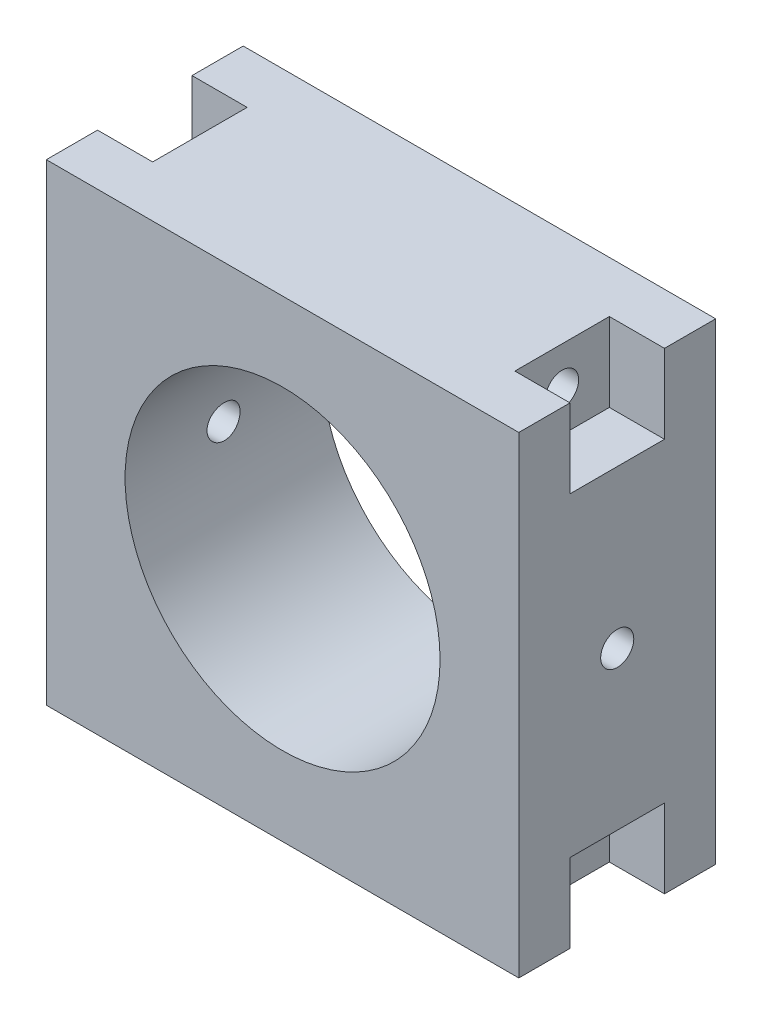
ISO-10303-21;
HEADER;
FILE_DESCRIPTION(('STEP AP214'),'2;1');
FILE_NAME('part.step','',(''),(''),'','','');
FILE_SCHEMA(('AUTOMOTIVE_DESIGN { 1 0 10303 214 1 1 1 1 }'));
ENDSEC;
DATA;
#1=APPLICATION_CONTEXT('core data for automotive mechanical design processes');
#2=APPLICATION_PROTOCOL_DEFINITION('international standard','automotive_design',2000,#1);
#3=PRODUCT_CONTEXT('',#1,'mechanical');
#4=PRODUCT('Part','Part','',(#3));
#5=PRODUCT_RELATED_PRODUCT_CATEGORY('part','',(#4));
#6=PRODUCT_DEFINITION_FORMATION('','',#4);
#7=PRODUCT_DEFINITION_CONTEXT('part definition',#1,'design');
#8=PRODUCT_DEFINITION('design','',#6,#7);
#9=PRODUCT_DEFINITION_SHAPE('','',#8);
#10=(LENGTH_UNIT() NAMED_UNIT(*) SI_UNIT(.MILLI.,.METRE.));
#11=(NAMED_UNIT(*) PLANE_ANGLE_UNIT() SI_UNIT($,.RADIAN.));
#12=(NAMED_UNIT(*) SI_UNIT($,.STERADIAN.) SOLID_ANGLE_UNIT());
#13=UNCERTAINTY_MEASURE_WITH_UNIT(LENGTH_MEASURE(1.E-05),#10,'distance_accuracy_value','');
#14=(GEOMETRIC_REPRESENTATION_CONTEXT(3) GLOBAL_UNCERTAINTY_ASSIGNED_CONTEXT((#13)) GLOBAL_UNIT_ASSIGNED_CONTEXT((#10,
#11,#12)) REPRESENTATION_CONTEXT('',''));
#15=CARTESIAN_POINT('',(0.,0.,0.));
#16=DIRECTION('',(0.,0.,1.));
#17=DIRECTION('',(1.,0.,0.));
#18=AXIS2_PLACEMENT_3D('',#15,#16,#17);
#19=CARTESIAN_POINT('',(-30.,0.,25.));
#20=DIRECTION('',(-1.,0.,0.));
#21=DIRECTION('',(0.,0.,1.));
#22=AXIS2_PLACEMENT_3D('',#19,#20,#21);
#23=PLANE('',#22);
#24=CARTESIAN_POINT('',(-30.,0.,12.5));
#25=DIRECTION('',(1.,0.,0.));
#26=DIRECTION('',(0.,0.,-1.));
#27=AXIS2_PLACEMENT_3D('',#24,#25,#26);
#28=CIRCLE('',#27,2.1);
#29=CARTESIAN_POINT('',(-30.,0.,10.4));
#30=VERTEX_POINT('',#29);
#31=EDGE_CURVE('E353',#30,#30,#28,.T.);
#32=ORIENTED_EDGE('',*,*,#31,.T.);
#33=EDGE_LOOP('',(#32));
#34=FACE_BOUND('',#33,.T.);
#35=DIRECTION('',(0.,0.,-1.));
#36=VECTOR('',#35,1.);
#37=CARTESIAN_POINT('',(-30.,-30.,25.));
#38=LINE('',#37,#36);
#39=CARTESIAN_POINT('',(-30.,-30.,6.5));
#40=VERTEX_POINT('',#39);
#41=CARTESIAN_POINT('',(-30.,-30.,0.));
#42=VERTEX_POINT('',#41);
#43=EDGE_CURVE('E378',#40,#42,#38,.T.);
#44=ORIENTED_EDGE('',*,*,#43,.F.);
#45=DIRECTION('',(0.,-1.,0.));
#46=VECTOR('',#45,1.);
#47=CARTESIAN_POINT('',(-30.,-20.,6.5));
#48=LINE('',#47,#46);
#49=CARTESIAN_POINT('',(-30.,-20.,6.5));
#50=VERTEX_POINT('',#49);
#51=EDGE_CURVE('E229',#50,#40,#48,.T.);
#52=ORIENTED_EDGE('',*,*,#51,.F.);
#53=DIRECTION('',(0.,0.,1.));
#54=VECTOR('',#53,1.);
#55=CARTESIAN_POINT('',(-30.,-20.,0.));
#56=LINE('',#55,#54);
#57=CARTESIAN_POINT('',(-30.,-20.,18.5));
#58=VERTEX_POINT('',#57);
#59=EDGE_CURVE('E209',#50,#58,#56,.T.);
#60=ORIENTED_EDGE('',*,*,#59,.T.);
#61=DIRECTION('',(0.,-1.,0.));
#62=VECTOR('',#61,1.);
#63=CARTESIAN_POINT('',(-30.,-20.,18.5));
#64=LINE('',#63,#62);
#65=CARTESIAN_POINT('',(-30.,-30.,18.5));
#66=VERTEX_POINT('',#65);
#67=EDGE_CURVE('E194',#58,#66,#64,.T.);
#68=ORIENTED_EDGE('',*,*,#67,.T.);
#69=CARTESIAN_POINT('',(-30.,-30.,25.));
#70=VERTEX_POINT('',#69);
#71=EDGE_CURVE('E399',#70,#66,#38,.T.);
#72=ORIENTED_EDGE('',*,*,#71,.F.);
#73=DIRECTION('',(0.,1.,0.));
#74=VECTOR('',#73,1.);
#75=CARTESIAN_POINT('',(-30.,0.,25.));
#76=LINE('',#75,#74);
#77=CARTESIAN_POINT('',(-30.,30.,25.));
#78=VERTEX_POINT('',#77);
#79=EDGE_CURVE('E370',#70,#78,#76,.T.);
#80=ORIENTED_EDGE('',*,*,#79,.T.);
#81=DIRECTION('',(0.,0.,-1.));
#82=VECTOR('',#81,1.);
#83=CARTESIAN_POINT('',(-30.,30.,25.));
#84=LINE('',#83,#82);
#85=CARTESIAN_POINT('',(-30.,30.,18.5));
#86=VERTEX_POINT('',#85);
#87=EDGE_CURVE('E404',#78,#86,#84,.T.);
#88=ORIENTED_EDGE('',*,*,#87,.T.);
#89=DIRECTION('',(0.,1.,0.));
#90=VECTOR('',#89,1.);
#91=CARTESIAN_POINT('',(-30.,20.,18.5));
#92=LINE('',#91,#90);
#93=CARTESIAN_POINT('',(-30.,20.,18.5));
#94=VERTEX_POINT('',#93);
#95=EDGE_CURVE('E301',#94,#86,#92,.T.);
#96=ORIENTED_EDGE('',*,*,#95,.F.);
#97=DIRECTION('',(0.,0.,1.));
#98=VECTOR('',#97,1.);
#99=CARTESIAN_POINT('',(-30.,20.,0.));
#100=LINE('',#99,#98);
#101=CARTESIAN_POINT('',(-30.,20.,6.5));
#102=VERTEX_POINT('',#101);
#103=EDGE_CURVE('E278',#102,#94,#100,.T.);
#104=ORIENTED_EDGE('',*,*,#103,.F.);
#105=DIRECTION('',(0.,1.,0.));
#106=VECTOR('',#105,1.);
#107=CARTESIAN_POINT('',(-30.,20.,6.5));
#108=LINE('',#107,#106);
#109=CARTESIAN_POINT('',(-30.,30.,6.5));
#110=VERTEX_POINT('',#109);
#111=EDGE_CURVE('E304',#102,#110,#108,.T.);
#112=ORIENTED_EDGE('',*,*,#111,.T.);
#113=CARTESIAN_POINT('',(-30.,30.,0.));
#114=VERTEX_POINT('',#113);
#115=EDGE_CURVE('E403',#110,#114,#84,.T.);
#116=ORIENTED_EDGE('',*,*,#115,.T.);
#117=DIRECTION('',(0.,1.,0.));
#118=VECTOR('',#117,1.);
#119=CARTESIAN_POINT('',(-30.,0.,0.));
#120=LINE('',#119,#118);
#121=EDGE_CURVE('E392',#42,#114,#120,.T.);
#122=ORIENTED_EDGE('',*,*,#121,.F.);
#123=EDGE_LOOP('',(#44,#52,#60,#68,#72,#80,#88,#96,#104,#112,#116,#122));
#124=FACE_BOUND('',#123,.T.);
#125=ADVANCED_FACE('F44',(#34,#124),#23,.T.);
#126=CARTESIAN_POINT('',(0.,-30.,25.));
#127=DIRECTION('',(0.,1.,0.));
#128=DIRECTION('',(0.,0.,1.));
#129=AXIS2_PLACEMENT_3D('',#126,#127,#128);
#130=PLANE('',#129);
#131=DIRECTION('',(-1.,0.,0.));
#132=VECTOR('',#131,1.);
#133=CARTESIAN_POINT('',(0.,-30.,6.49999999999996));
#134=LINE('',#133,#132);
#135=CARTESIAN_POINT('',(-23.,-30.,6.5));
#136=VERTEX_POINT('',#135);
#137=EDGE_CURVE('E204',#136,#40,#134,.T.);
#138=ORIENTED_EDGE('',*,*,#137,.T.);
#139=ORIENTED_EDGE('',*,*,#43,.T.);
#140=DIRECTION('',(1.,0.,0.));
#141=VECTOR('',#140,1.);
#142=CARTESIAN_POINT('',(0.,-30.,0.));
#143=LINE('',#142,#141);
#144=CARTESIAN_POINT('',(30.,-30.,0.));
#145=VERTEX_POINT('',#144);
#146=EDGE_CURVE('E379',#42,#145,#143,.T.);
#147=ORIENTED_EDGE('',*,*,#146,.T.);
#148=DIRECTION('',(0.,0.,-1.));
#149=VECTOR('',#148,1.);
#150=CARTESIAN_POINT('',(30.,-30.,25.));
#151=LINE('',#150,#149);
#152=CARTESIAN_POINT('',(30.,-30.,6.50000000000001));
#153=VERTEX_POINT('',#152);
#154=EDGE_CURVE('E54',#153,#145,#151,.T.);
#155=ORIENTED_EDGE('',*,*,#154,.F.);
#156=DIRECTION('',(1.,0.,0.));
#157=VECTOR('',#156,1.);
#158=CARTESIAN_POINT('',(0.,-30.,6.49999999999996));
#159=LINE('',#158,#157);
#160=CARTESIAN_POINT('',(23.,-30.,6.5));
#161=VERTEX_POINT('',#160);
#162=EDGE_CURVE('E251',#161,#153,#159,.T.);
#163=ORIENTED_EDGE('',*,*,#162,.F.);
#164=DIRECTION('',(0.,0.,-1.));
#165=VECTOR('',#164,1.);
#166=CARTESIAN_POINT('',(23.,-30.,0.));
#167=LINE('',#166,#165);
#168=CARTESIAN_POINT('',(23.,-30.,18.5));
#169=VERTEX_POINT('',#168);
#170=EDGE_CURVE('E239',#169,#161,#167,.T.);
#171=ORIENTED_EDGE('',*,*,#170,.F.);
#172=DIRECTION('',(1.,0.,0.));
#173=VECTOR('',#172,1.);
#174=CARTESIAN_POINT('',(0.,-30.,18.5));
#175=LINE('',#174,#173);
#176=CARTESIAN_POINT('',(30.,-30.,18.5));
#177=VERTEX_POINT('',#176);
#178=EDGE_CURVE('E254',#169,#177,#175,.T.);
#179=ORIENTED_EDGE('',*,*,#178,.T.);
#180=CARTESIAN_POINT('',(30.,-30.,25.));
#181=VERTEX_POINT('',#180);
#182=EDGE_CURVE('E11',#181,#177,#151,.T.);
#183=ORIENTED_EDGE('',*,*,#182,.F.);
#184=DIRECTION('',(1.,0.,0.));
#185=VECTOR('',#184,1.);
#186=CARTESIAN_POINT('',(0.,-30.,25.));
#187=LINE('',#186,#185);
#188=EDGE_CURVE('E358',#70,#181,#187,.T.);
#189=ORIENTED_EDGE('',*,*,#188,.F.);
#190=ORIENTED_EDGE('',*,*,#71,.T.);
#191=DIRECTION('',(-1.,0.,0.));
#192=VECTOR('',#191,1.);
#193=CARTESIAN_POINT('',(0.,-30.,18.5));
#194=LINE('',#193,#192);
#195=CARTESIAN_POINT('',(-23.,-30.,18.5));
#196=VERTEX_POINT('',#195);
#197=EDGE_CURVE('E218',#196,#66,#194,.T.);
#198=ORIENTED_EDGE('',*,*,#197,.F.);
#199=DIRECTION('',(0.,0.,-1.));
#200=VECTOR('',#199,1.);
#201=CARTESIAN_POINT('',(-23.,-30.,0.));
#202=LINE('',#201,#200);
#203=EDGE_CURVE('E62',#196,#136,#202,.T.);
#204=ORIENTED_EDGE('',*,*,#203,.T.);
#205=EDGE_LOOP('',(#138,#139,#147,#155,#163,#171,#179,#183,#189,#190,#198,#204));
#206=FACE_BOUND('',#205,.T.);
#207=ADVANCED_FACE('F46',(#206),#130,.F.);
#208=CARTESIAN_POINT('',(30.,0.,25.));
#209=DIRECTION('',(-1.,0.,0.));
#210=DIRECTION('',(0.,0.,1.));
#211=AXIS2_PLACEMENT_3D('',#208,#209,#210);
#212=PLANE('',#211);
#213=DIRECTION('',(0.,0.,-1.));
#214=VECTOR('',#213,1.);
#215=CARTESIAN_POINT('',(30.,-20.,0.));
#216=LINE('',#215,#214);
#217=CARTESIAN_POINT('',(30.,-20.,18.5));
#218=VERTEX_POINT('',#217);
#219=CARTESIAN_POINT('',(30.,-20.,6.50000000000001));
#220=VERTEX_POINT('',#219);
#221=EDGE_CURVE('E238',#218,#220,#216,.T.);
#222=ORIENTED_EDGE('',*,*,#221,.T.);
#223=DIRECTION('',(0.,-1.,0.));
#224=VECTOR('',#223,1.);
#225=CARTESIAN_POINT('',(30.,-20.,6.50000000000001));
#226=LINE('',#225,#224);
#227=EDGE_CURVE('E250',#220,#153,#226,.T.);
#228=ORIENTED_EDGE('',*,*,#227,.T.);
#229=ORIENTED_EDGE('',*,*,#154,.T.);
#230=DIRECTION('',(0.,1.,0.));
#231=VECTOR('',#230,1.);
#232=CARTESIAN_POINT('',(30.,0.,0.));
#233=LINE('',#232,#231);
#234=CARTESIAN_POINT('',(30.,30.,0.));
#235=VERTEX_POINT('',#234);
#236=EDGE_CURVE('E383',#145,#235,#233,.T.);
#237=ORIENTED_EDGE('',*,*,#236,.T.);
#238=DIRECTION('',(0.,0.,-1.));
#239=VECTOR('',#238,1.);
#240=CARTESIAN_POINT('',(30.,30.,25.));
#241=LINE('',#240,#239);
#242=CARTESIAN_POINT('',(30.,30.,6.50000000000001));
#243=VERTEX_POINT('',#242);
#244=EDGE_CURVE('E408',#243,#235,#241,.T.);
#245=ORIENTED_EDGE('',*,*,#244,.F.);
#246=DIRECTION('',(0.,1.,0.));
#247=VECTOR('',#246,1.);
#248=CARTESIAN_POINT('',(30.,20.,6.50000000000001));
#249=LINE('',#248,#247);
#250=CARTESIAN_POINT('',(30.,20.,6.50000000000001));
#251=VERTEX_POINT('',#250);
#252=EDGE_CURVE('E291',#251,#243,#249,.T.);
#253=ORIENTED_EDGE('',*,*,#252,.F.);
#254=DIRECTION('',(0.,0.,-1.));
#255=VECTOR('',#254,1.);
#256=CARTESIAN_POINT('',(30.,20.,0.));
#257=LINE('',#256,#255);
#258=CARTESIAN_POINT('',(30.,20.,18.5));
#259=VERTEX_POINT('',#258);
#260=EDGE_CURVE('E321',#259,#251,#257,.T.);
#261=ORIENTED_EDGE('',*,*,#260,.F.);
#262=DIRECTION('',(0.,1.,0.));
#263=VECTOR('',#262,1.);
#264=CARTESIAN_POINT('',(30.,20.,18.5));
#265=LINE('',#264,#263);
#266=CARTESIAN_POINT('',(30.,30.,18.5));
#267=VERTEX_POINT('',#266);
#268=EDGE_CURVE('E338',#259,#267,#265,.T.);
#269=ORIENTED_EDGE('',*,*,#268,.T.);
#270=CARTESIAN_POINT('',(30.,30.,25.));
#271=VERTEX_POINT('',#270);
#272=EDGE_CURVE('E409',#271,#267,#241,.T.);
#273=ORIENTED_EDGE('',*,*,#272,.F.);
#274=DIRECTION('',(0.,1.,0.));
#275=VECTOR('',#274,1.);
#276=CARTESIAN_POINT('',(30.,0.,25.));
#277=LINE('',#276,#275);
#278=EDGE_CURVE('E362',#181,#271,#277,.T.);
#279=ORIENTED_EDGE('',*,*,#278,.F.);
#280=ORIENTED_EDGE('',*,*,#182,.T.);
#281=DIRECTION('',(0.,-1.,0.));
#282=VECTOR('',#281,1.);
#283=CARTESIAN_POINT('',(30.,-20.,18.5));
#284=LINE('',#283,#282);
#285=EDGE_CURVE('E70',#218,#177,#284,.T.);
#286=ORIENTED_EDGE('',*,*,#285,.F.);
#287=EDGE_LOOP('',(#222,#228,#229,#237,#245,#253,#261,#269,#273,#279,#280,#286));
#288=FACE_BOUND('',#287,.T.);
#289=CARTESIAN_POINT('',(30.,0.,12.5));
#290=DIRECTION('',(1.,0.,0.));
#291=DIRECTION('',(0.,0.,-1.));
#292=AXIS2_PLACEMENT_3D('',#289,#290,#291);
#293=CIRCLE('',#292,2.1);
#294=CARTESIAN_POINT('',(30.,0.,10.4));
#295=VERTEX_POINT('',#294);
#296=EDGE_CURVE('E348',#295,#295,#293,.T.);
#297=ORIENTED_EDGE('',*,*,#296,.F.);
#298=EDGE_LOOP('',(#297));
#299=FACE_BOUND('',#298,.T.);
#300=ADVANCED_FACE('F456',(#288,#299),#212,.F.);
#301=CARTESIAN_POINT('',(0.,30.,25.));
#302=DIRECTION('',(0.,1.,0.));
#303=DIRECTION('',(0.,0.,1.));
#304=AXIS2_PLACEMENT_3D('',#301,#302,#303);
#305=PLANE('',#304);
#306=DIRECTION('',(0.,0.,-1.));
#307=VECTOR('',#306,1.);
#308=CARTESIAN_POINT('',(-23.,30.,0.));
#309=LINE('',#308,#307);
#310=CARTESIAN_POINT('',(-23.,30.,18.5));
#311=VERTEX_POINT('',#310);
#312=CARTESIAN_POINT('',(-23.,30.,6.5));
#313=VERTEX_POINT('',#312);
#314=EDGE_CURVE('E286',#311,#313,#309,.T.);
#315=ORIENTED_EDGE('',*,*,#314,.F.);
#316=DIRECTION('',(-1.,0.,0.));
#317=VECTOR('',#316,1.);
#318=CARTESIAN_POINT('',(0.,30.,18.5));
#319=LINE('',#318,#317);
#320=EDGE_CURVE('E275',#311,#86,#319,.T.);
#321=ORIENTED_EDGE('',*,*,#320,.T.);
#322=ORIENTED_EDGE('',*,*,#87,.F.);
#323=DIRECTION('',(1.,0.,0.));
#324=VECTOR('',#323,1.);
#325=CARTESIAN_POINT('',(0.,30.,25.));
#326=LINE('',#325,#324);
#327=EDGE_CURVE('E366',#78,#271,#326,.T.);
#328=ORIENTED_EDGE('',*,*,#327,.T.);
#329=ORIENTED_EDGE('',*,*,#272,.T.);
#330=DIRECTION('',(1.,0.,0.));
#331=VECTOR('',#330,1.);
#332=CARTESIAN_POINT('',(0.,30.,18.5));
#333=LINE('',#332,#331);
#334=CARTESIAN_POINT('',(23.,30.,18.5));
#335=VERTEX_POINT('',#334);
#336=EDGE_CURVE('E314',#335,#267,#333,.T.);
#337=ORIENTED_EDGE('',*,*,#336,.F.);
#338=DIRECTION('',(0.,0.,-1.));
#339=VECTOR('',#338,1.);
#340=CARTESIAN_POINT('',(23.,30.,0.));
#341=LINE('',#340,#339);
#342=CARTESIAN_POINT('',(23.,30.,6.5));
#343=VERTEX_POINT('',#342);
#344=EDGE_CURVE('E330',#335,#343,#341,.T.);
#345=ORIENTED_EDGE('',*,*,#344,.T.);
#346=DIRECTION('',(1.,0.,0.));
#347=VECTOR('',#346,1.);
#348=CARTESIAN_POINT('',(0.,30.,6.49999999999996));
#349=LINE('',#348,#347);
#350=EDGE_CURVE('E326',#343,#243,#349,.T.);
#351=ORIENTED_EDGE('',*,*,#350,.T.);
#352=ORIENTED_EDGE('',*,*,#244,.T.);
#353=DIRECTION('',(1.,0.,0.));
#354=VECTOR('',#353,1.);
#355=CARTESIAN_POINT('',(0.,30.,0.));
#356=LINE('',#355,#354);
#357=EDGE_CURVE('E388',#114,#235,#356,.T.);
#358=ORIENTED_EDGE('',*,*,#357,.F.);
#359=ORIENTED_EDGE('',*,*,#115,.F.);
#360=DIRECTION('',(-1.,0.,0.));
#361=VECTOR('',#360,1.);
#362=CARTESIAN_POINT('',(0.,30.,6.49999999999996));
#363=LINE('',#362,#361);
#364=EDGE_CURVE('E290',#313,#110,#363,.T.);
#365=ORIENTED_EDGE('',*,*,#364,.F.);
#366=EDGE_LOOP('',(#315,#321,#322,#328,#329,#337,#345,#351,#352,#358,#359,#365));
#367=FACE_BOUND('',#366,.T.);
#368=ADVANCED_FACE('F460',(#367),#305,.T.);
#369=CARTESIAN_POINT('',(0.,0.,25.));
#370=DIRECTION('',(0.,0.,-1.));
#371=DIRECTION('',(-1.,0.,0.));
#372=AXIS2_PLACEMENT_3D('',#369,#370,#371);
#373=CYLINDRICAL_SURFACE('',#372,20.);
#374=CARTESIAN_POINT('',(-20.,0.,14.6));
#375=CARTESIAN_POINT('',(-19.9999985861225,-0.117610574556953,14.5999949230642));
#376=CARTESIAN_POINT('',(-19.9989515701418,-0.235298131378431,14.5900865495256));
#377=CARTESIAN_POINT('',(-19.9948755007952,-0.467408281963046,14.5507109273298));
#378=CARTESIAN_POINT('',(-19.9918442846137,-0.581827170618682,14.52122233536));
#379=CARTESIAN_POINT('',(-19.9841418596598,-0.804005356961038,14.4435561221623));
#380=CARTESIAN_POINT('',(-19.9794716623513,-0.911768713849171,14.3953900254574));
#381=CARTESIAN_POINT('',(-19.9690129744413,-1.11765859904565,14.2817589762977));
#382=CARTESIAN_POINT('',(-19.963224700667,-1.2157869902952,14.2162973770353));
#383=CARTESIAN_POINT('',(-19.9511523144023,-1.40003175469819,14.069656435472));
#384=CARTESIAN_POINT('',(-19.9448665314529,-1.48610471828674,13.9884226842205));
#385=CARTESIAN_POINT('',(-19.9325213225088,-1.64342207671848,13.8126596136441));
#386=CARTESIAN_POINT('',(-19.9264619071801,-1.71466577354684,13.7181296688172));
#387=CARTESIAN_POINT('',(-19.915238578931,-1.84045763756347,13.5181837270879));
#388=CARTESIAN_POINT('',(-19.9100768004705,-1.89496624010398,13.4127427088117));
#389=CARTESIAN_POINT('',(-19.9012541874175,-1.98548798456523,13.1941409242799));
#390=CARTESIAN_POINT('',(-19.8975933121633,-2.02150162754854,13.080980367255));
#391=CARTESIAN_POINT('',(-19.8922022962288,-2.07388179744854,12.8505961431444));
#392=CARTESIAN_POINT('',(-19.890465054272,-2.09032060381389,12.7333890784955));
#393=CARTESIAN_POINT('',(-19.889096025595,-2.10330793490494,12.4978676604021));
#394=CARTESIAN_POINT('',(-19.8894641782095,-2.09985703273741,12.3795533389603));
#395=CARTESIAN_POINT('',(-19.8922578534938,-2.07322243378021,12.1456751550686));
#396=CARTESIAN_POINT('',(-19.8946751346228,-2.05011778256067,12.0301021784106));
#397=CARTESIAN_POINT('',(-19.9012818323377,-1.98495459652899,11.8044833478823));
#398=CARTESIAN_POINT('',(-19.9054712750661,-1.94289578210746,11.6944375755754));
#399=CARTESIAN_POINT('',(-19.9151597133921,-1.84093133329277,11.48274800286));
#400=CARTESIAN_POINT('',(-19.9206612683861,-1.78099076082822,11.3811211529613));
#401=CARTESIAN_POINT('',(-19.9323519192806,-1.64498937257378,11.1893397702597));
#402=CARTESIAN_POINT('',(-19.9385410373735,-1.56892803638548,11.0991856079598));
#403=CARTESIAN_POINT('',(-19.9509461711086,-1.40240335664829,10.9324495098156));
#404=CARTESIAN_POINT('',(-19.9571621711797,-1.31187177127052,10.8559357115762));
#405=CARTESIAN_POINT('',(-19.968892312137,-1.11921304858704,10.7191808453474));
#406=CARTESIAN_POINT('',(-19.9744064521085,-1.01708589617182,10.6589397985622));
#407=CARTESIAN_POINT('',(-19.9841136624366,-0.804086871738415,10.5564426844708));
#408=CARTESIAN_POINT('',(-19.9883064679749,-0.693213252337617,10.514190221792));
#409=CARTESIAN_POINT('',(-19.9948959572163,-0.465891500761026,10.4489203604243));
#410=CARTESIAN_POINT('',(-19.9972927001549,-0.349443552565791,10.4259023273658));
#411=CARTESIAN_POINT('',(-20.0000123913183,-0.114868577013525,10.39984150458));
#412=CARTESIAN_POINT('',(-20.0003450977805,0.00324789921030634,10.3967047198591));
#413=CARTESIAN_POINT('',(-19.9989254280681,0.238324864201357,10.4102483450366));
#414=CARTESIAN_POINT('',(-19.997173083004,0.355285370190177,10.4269284592536));
#415=CARTESIAN_POINT('',(-19.9917864257121,0.584457914380878,10.4795543943113));
#416=CARTESIAN_POINT('',(-19.9881564277171,0.696680202830055,10.5154560569179));
#417=CARTESIAN_POINT('',(-19.9794215373593,0.91350972665413,10.6054604957932));
#418=CARTESIAN_POINT('',(-19.9743166087398,1.01811677475236,10.6595637194972));
#419=CARTESIAN_POINT('',(-19.9631781959612,1.21717044721087,10.784667555895));
#420=CARTESIAN_POINT('',(-19.9571413566862,1.31157817667962,10.8557297509654));
#421=CARTESIAN_POINT('',(-19.9448268762315,1.48715924360521,11.0126462530323));
#422=CARTESIAN_POINT('',(-19.9385492283796,1.56833221403401,11.0985009701211));
#423=CARTESIAN_POINT('',(-19.9264311606194,1.71546723142883,11.2829762753991));
#424=CARTESIAN_POINT('',(-19.9205925796686,1.78136747427046,11.3816462956563));
#425=CARTESIAN_POINT('',(-19.9100421218507,1.8956611208723,11.5887082401009));
#426=CARTESIAN_POINT('',(-19.9053302282213,1.94405478509178,11.6971000196201));
#427=CARTESIAN_POINT('',(-19.8975783355781,2.02185870687172,11.9203189781473));
#428=CARTESIAN_POINT('',(-19.8945351306546,2.0513053846878,12.0351333467435));
#429=CARTESIAN_POINT('',(-19.8904553699829,2.09049747040514,12.2681105197299));
#430=CARTESIAN_POINT('',(-19.8894187502379,2.10024350662608,12.3862732172086));
#431=CARTESIAN_POINT('',(-19.8894709750246,2.09974842606066,12.6219784686339));
#432=CARTESIAN_POINT('',(-19.8905494954156,2.08960439407621,12.7395212407998));
#433=CARTESIAN_POINT('',(-19.8946884320046,2.04982105883557,12.9712226791796));
#434=CARTESIAN_POINT('',(-19.8977488501174,2.02018173674434,13.0853813421239));
#435=CARTESIAN_POINT('',(-19.9055038265572,1.94227663661315,13.3070710411124));
#436=CARTESIAN_POINT('',(-19.9101981047892,1.8940140510329,13.4146032094297));
#437=CARTESIAN_POINT('',(-19.9206924240923,1.78024229516215,13.6200565415963));
#438=CARTESIAN_POINT('',(-19.9264924626736,1.71473316370626,13.7179777270863));
#439=CARTESIAN_POINT('',(-19.9385787157003,1.56796388588165,13.9019269252103));
#440=CARTESIAN_POINT('',(-19.9448670815623,1.4866313492115,13.9878970396921));
#441=CARTESIAN_POINT('',(-19.9572018929493,1.3106694114521,14.1450103088069));
#442=CARTESIAN_POINT('',(-19.9632482803496,1.21603683994904,14.216149918128));
#443=CARTESIAN_POINT('',(-19.9744353744075,1.01587362585845,14.3417393164675));
#444=CARTESIAN_POINT('',(-19.9795735493958,0.910313780947585,14.396142755599));
#445=CARTESIAN_POINT('',(-19.9883382268767,0.691568973167297,14.4863785506049));
#446=CARTESIAN_POINT('',(-19.9919664216766,0.578392712609077,14.5222317076953));
#447=CARTESIAN_POINT('',(-19.9963973899638,0.387154461046656,14.5654739129788));
#448=CARTESIAN_POINT('',(-19.9977420180587,0.310312187595179,14.5784033405654));
#449=CARTESIAN_POINT('',(-19.9995437889269,0.155657848500259,14.5956680442412));
#450=CARTESIAN_POINT('',(-20.0000009358377,0.0778457873796139,14.6000033603957));
#451=CARTESIAN_POINT('',(-20.,0.,14.6));
#452=B_SPLINE_CURVE_WITH_KNOTS('',3,(#374,#375,#376,#377,#378,#379,#380,#381,#382,#383,#384,
#385,#386,#387,#388,#389,#390,#391,#392,#393,#394,#395,#396,#397,#398,#399,#400,#401,#402,#403,
#404,#405,#406,#407,#408,#409,#410,#411,#412,#413,#414,#415,#416,#417,#418,#419,#420,#421,#422,
#423,#424,#425,#426,#427,#428,#429,#430,#431,#432,#433,#434,#435,#436,#437,#438,#439,#440,#441,
#442,#443,#444,#445,#446,#447,#448,#449,#450,#451),.UNSPECIFIED.,.T.,.F.,(4,2,2,2,2,2,2,2,2,2,2,
2,2,2,2,2,2,2,2,2,2,2,2,2,2,2,2,2,2,2,2,2,2,2,2,2,2,2,4),(0.,0.352547445376477,
0.705479815473272,1.05819476242917,1.41084137634127,1.76472684686617,2.11862897104477,
2.47336144998344,2.82808431805778,3.18149328120567,3.53489206119519,3.8868761877292,
4.2388655068582,4.59154711145463,4.94424010278876,5.29864833369556,5.65305702641607,
6.00753670363999,6.36200468932826,6.71479555573139,7.06758115832308,7.41955975201312,
7.7715469987624,8.12483238904231,8.47812757501263,8.8328284043015,9.18752395620733,
9.54153565252774,9.89553605804705,10.2478128639807,10.6000900102609,10.9523067948682,
11.3045227863845,11.6583897165679,12.0123411437847,12.3672641737055,12.7217883461217,
12.955138633902,13.1884878338135),.UNSPECIFIED.);
#453=CARTESIAN_POINT('',(-20.,0.,14.6));
#454=VERTEX_POINT('',#453);
#455=EDGE_CURVE('E384',#454,#454,#452,.T.);
#456=ORIENTED_EDGE('',*,*,#455,.F.);
#457=EDGE_LOOP('',(#456));
#458=FACE_BOUND('',#457,.T.);
#459=CARTESIAN_POINT('',(20.,0.,10.4));
#460=CARTESIAN_POINT('',(19.9999985861225,-0.117610574556953,10.4000050769358));
#461=CARTESIAN_POINT('',(19.9989515701418,-0.235298131378431,10.4099134504744));
#462=CARTESIAN_POINT('',(19.9948755007952,-0.467408281963046,10.4492890726702));
#463=CARTESIAN_POINT('',(19.9918442846137,-0.581827170618682,10.47877766464));
#464=CARTESIAN_POINT('',(19.9841418596598,-0.804005356961037,10.5564438778377));
#465=CARTESIAN_POINT('',(19.9794716623513,-0.911768713849169,10.6046099745426));
#466=CARTESIAN_POINT('',(19.9690129744413,-1.11765859904565,10.7182410237023));
#467=CARTESIAN_POINT('',(19.963224700667,-1.2157869902952,10.7837026229647));
#468=CARTESIAN_POINT('',(19.9511523144023,-1.40003175469819,10.930343564528));
#469=CARTESIAN_POINT('',(19.9448665314529,-1.48610471828674,11.0115773157795));
#470=CARTESIAN_POINT('',(19.9325213225088,-1.64342207671848,11.1873403863559));
#471=CARTESIAN_POINT('',(19.9264619071801,-1.71466577354684,11.2818703311828));
#472=CARTESIAN_POINT('',(19.915238578931,-1.84045763756347,11.4818162729121));
#473=CARTESIAN_POINT('',(19.9100768004705,-1.89496624010398,11.5872572911883));
#474=CARTESIAN_POINT('',(19.9012541874175,-1.98548798456523,11.8058590757201));
#475=CARTESIAN_POINT('',(19.8975933121633,-2.02150162754854,11.919019632745));
#476=CARTESIAN_POINT('',(19.8922022962288,-2.07388179744854,12.1494038568556));
#477=CARTESIAN_POINT('',(19.890465054272,-2.09032060381389,12.2666109215045));
#478=CARTESIAN_POINT('',(19.889096025595,-2.10330793490494,12.5021323395979));
#479=CARTESIAN_POINT('',(19.8894641782095,-2.09985703273741,12.6204466610397));
#480=CARTESIAN_POINT('',(19.8922578534938,-2.07322243378021,12.8543248449314));
#481=CARTESIAN_POINT('',(19.8946751346228,-2.05011778256067,12.9698978215894));
#482=CARTESIAN_POINT('',(19.9012818323377,-1.98495459652899,13.1955166521177));
#483=CARTESIAN_POINT('',(19.9054712750661,-1.94289578210746,13.3055624244246));
#484=CARTESIAN_POINT('',(19.9151597133921,-1.84093133329277,13.51725199714));
#485=CARTESIAN_POINT('',(19.9206612683861,-1.78099076082822,13.6188788470387));
#486=CARTESIAN_POINT('',(19.9323519192806,-1.64498937257378,13.8106602297403));
#487=CARTESIAN_POINT('',(19.9385410373735,-1.56892803638547,13.9008143920402));
#488=CARTESIAN_POINT('',(19.9509461711086,-1.40240335664829,14.0675504901844));
#489=CARTESIAN_POINT('',(19.9571621711797,-1.31187177127052,14.1440642884238));
#490=CARTESIAN_POINT('',(19.968892312137,-1.11921304858704,14.2808191546526));
#491=CARTESIAN_POINT('',(19.9744064521085,-1.01708589617182,14.3410602014378));
#492=CARTESIAN_POINT('',(19.9841136624366,-0.804086871738416,14.4435573155292));
#493=CARTESIAN_POINT('',(19.9883064679749,-0.693213252337618,14.485809778208));
#494=CARTESIAN_POINT('',(19.9948959572163,-0.465891500761026,14.5510796395757));
#495=CARTESIAN_POINT('',(19.9972927001549,-0.349443552565791,14.5740976726342));
#496=CARTESIAN_POINT('',(20.0000123913183,-0.114868577013525,14.60015849542));
#497=CARTESIAN_POINT('',(20.0003450977805,0.0032478992103063,14.6032952801409));
#498=CARTESIAN_POINT('',(19.9989254280681,0.238324864201357,14.5897516549634));
#499=CARTESIAN_POINT('',(19.997173083004,0.355285370190177,14.5730715407464));
#500=CARTESIAN_POINT('',(19.9917864257121,0.584457914380878,14.5204456056887));
#501=CARTESIAN_POINT('',(19.9881564277171,0.696680202830054,14.4845439430821));
#502=CARTESIAN_POINT('',(19.9794215373593,0.913509726654129,14.3945395042068));
#503=CARTESIAN_POINT('',(19.9743166087398,1.01811677475236,14.3404362805028));
#504=CARTESIAN_POINT('',(19.9631781959612,1.21717044721087,14.215332444105));
#505=CARTESIAN_POINT('',(19.9571413566862,1.31157817667962,14.1442702490346));
#506=CARTESIAN_POINT('',(19.9448268762315,1.48715924360521,13.9873537469677));
#507=CARTESIAN_POINT('',(19.9385492283796,1.56833221403401,13.9014990298789));
#508=CARTESIAN_POINT('',(19.9264311606194,1.71546723142883,13.7170237246009));
#509=CARTESIAN_POINT('',(19.9205925796686,1.78136747427046,13.6183537043437));
#510=CARTESIAN_POINT('',(19.9100421218507,1.8956611208723,13.4112917598991));
#511=CARTESIAN_POINT('',(19.9053302282213,1.94405478509178,13.3028999803799));
#512=CARTESIAN_POINT('',(19.8975783355781,2.02185870687172,13.0796810218527));
#513=CARTESIAN_POINT('',(19.8945351306546,2.0513053846878,12.9648666532565));
#514=CARTESIAN_POINT('',(19.8904553699829,2.09049747040514,12.7318894802701));
#515=CARTESIAN_POINT('',(19.8894187502379,2.10024350662608,12.6137267827914));
#516=CARTESIAN_POINT('',(19.8894709750246,2.09974842606066,12.3780215313661));
#517=CARTESIAN_POINT('',(19.8905494954156,2.08960439407621,12.2604787592002));
#518=CARTESIAN_POINT('',(19.8946884320046,2.04982105883557,12.0287773208204));
#519=CARTESIAN_POINT('',(19.8977488501174,2.02018173674434,11.9146186578761));
#520=CARTESIAN_POINT('',(19.9055038265572,1.94227663661315,11.6929289588876));
#521=CARTESIAN_POINT('',(19.9101981047892,1.8940140510329,11.5853967905703));
#522=CARTESIAN_POINT('',(19.9206924240923,1.78024229516215,11.3799434584037));
#523=CARTESIAN_POINT('',(19.9264924626736,1.71473316370626,11.2820222729137));
#524=CARTESIAN_POINT('',(19.9385787157003,1.56796388588165,11.0980730747897));
#525=CARTESIAN_POINT('',(19.9448670815623,1.4866313492115,11.0121029603079));
#526=CARTESIAN_POINT('',(19.9572018929493,1.3106694114521,10.8549896911931));
#527=CARTESIAN_POINT('',(19.9632482803496,1.21603683994904,10.783850081872));
#528=CARTESIAN_POINT('',(19.9744353744075,1.01587362585845,10.6582606835325));
#529=CARTESIAN_POINT('',(19.9795735493958,0.910313780947585,10.603857244401));
#530=CARTESIAN_POINT('',(19.9883382268767,0.691568973167297,10.5136214493951));
#531=CARTESIAN_POINT('',(19.9919664216766,0.578392712609078,10.4777682923047));
#532=CARTESIAN_POINT('',(19.9963973899638,0.387154461046656,10.4345260870212));
#533=CARTESIAN_POINT('',(19.9977420180587,0.310312187595179,10.4215966594346));
#534=CARTESIAN_POINT('',(19.9995437889269,0.155657848500259,10.4043319557588));
#535=CARTESIAN_POINT('',(20.0000009358377,0.0778457873796139,10.3999966396043));
#536=CARTESIAN_POINT('',(20.,0.,10.4));
#537=B_SPLINE_CURVE_WITH_KNOTS('',3,(#459,#460,#461,#462,#463,#464,#465,#466,#467,#468,#469,
#470,#471,#472,#473,#474,#475,#476,#477,#478,#479,#480,#481,#482,#483,#484,#485,#486,#487,#488,
#489,#490,#491,#492,#493,#494,#495,#496,#497,#498,#499,#500,#501,#502,#503,#504,#505,#506,#507,
#508,#509,#510,#511,#512,#513,#514,#515,#516,#517,#518,#519,#520,#521,#522,#523,#524,#525,#526,
#527,#528,#529,#530,#531,#532,#533,#534,#535,#536),.UNSPECIFIED.,.T.,.F.,(4,2,2,2,2,2,2,2,2,2,2,
2,2,2,2,2,2,2,2,2,2,2,2,2,2,2,2,2,2,2,2,2,2,2,2,2,2,2,4),(0.,0.352547445376477,
0.705479815473272,1.05819476242917,1.41084137634127,1.76472684686617,2.11862897104477,
2.47336144998344,2.82808431805778,3.18149328120567,3.53489206119519,3.8868761877292,
4.2388655068582,4.59154711145464,4.94424010278876,5.29864833369556,5.65305702641607,
6.00753670363999,6.36200468932826,6.71479555573139,7.06758115832308,7.41955975201312,
7.7715469987624,8.12483238904231,8.47812757501264,8.8328284043015,9.18752395620733,
9.54153565252774,9.89553605804705,10.2478128639807,10.6000900102609,10.9523067948682,
11.3045227863845,11.6583897165679,12.0123411437847,12.3672641737055,12.7217883461217,
12.9551386339019,13.1884878338135),.UNSPECIFIED.);
#538=CARTESIAN_POINT('',(20.,0.,10.4));
#539=VERTEX_POINT('',#538);
#540=EDGE_CURVE('E352',#539,#539,#537,.T.);
#541=ORIENTED_EDGE('',*,*,#540,.F.);
#542=EDGE_LOOP('',(#541));
#543=FACE_BOUND('',#542,.T.);
#544=CARTESIAN_POINT('',(0.,0.,25.));
#545=DIRECTION('',(0.,0.,1.));
#546=DIRECTION('',(1.,0.,0.));
#547=AXIS2_PLACEMENT_3D('',#544,#545,#546);
#548=CIRCLE('',#547,20.);
#549=CARTESIAN_POINT('',(20.,0.,25.));
#550=VERTEX_POINT('',#549);
#551=EDGE_CURVE('E374',#550,#550,#548,.T.);
#552=ORIENTED_EDGE('',*,*,#551,.T.);
#553=EDGE_LOOP('',(#552));
#554=FACE_BOUND('',#553,.T.);
#555=CARTESIAN_POINT('',(0.,0.,0.));
#556=DIRECTION('',(0.,0.,1.));
#557=DIRECTION('',(1.,0.,0.));
#558=AXIS2_PLACEMENT_3D('',#555,#556,#557);
#559=CIRCLE('',#558,20.);
#560=CARTESIAN_POINT('',(20.,0.,0.));
#561=VERTEX_POINT('',#560);
#562=EDGE_CURVE('E363',#561,#561,#559,.T.);
#563=ORIENTED_EDGE('',*,*,#562,.F.);
#564=EDGE_LOOP('',(#563));
#565=FACE_BOUND('',#564,.T.);
#566=ADVANCED_FACE('F425',(#458,#543,#554,#565),#373,.F.);
#567=CARTESIAN_POINT('',(0.,0.,25.));
#568=DIRECTION('',(0.,0.,1.));
#569=DIRECTION('',(1.,0.,0.));
#570=AXIS2_PLACEMENT_3D('',#567,#568,#569);
#571=PLANE('',#570);
#572=ORIENTED_EDGE('',*,*,#188,.T.);
#573=ORIENTED_EDGE('',*,*,#278,.T.);
#574=ORIENTED_EDGE('',*,*,#327,.F.);
#575=ORIENTED_EDGE('',*,*,#79,.F.);
#576=EDGE_LOOP('',(#572,#573,#574,#575));
#577=FACE_BOUND('',#576,.T.);
#578=ORIENTED_EDGE('',*,*,#551,.F.);
#579=EDGE_LOOP('',(#578));
#580=FACE_BOUND('',#579,.T.);
#581=ADVANCED_FACE('F439',(#577,#580),#571,.T.);
#582=CARTESIAN_POINT('',(0.,0.,0.));
#583=DIRECTION('',(0.,0.,1.));
#584=DIRECTION('',(1.,0.,0.));
#585=AXIS2_PLACEMENT_3D('',#582,#583,#584);
#586=PLANE('',#585);
#587=ORIENTED_EDGE('',*,*,#146,.F.);
#588=ORIENTED_EDGE('',*,*,#121,.T.);
#589=ORIENTED_EDGE('',*,*,#357,.T.);
#590=ORIENTED_EDGE('',*,*,#236,.F.);
#591=EDGE_LOOP('',(#587,#588,#589,#590));
#592=FACE_BOUND('',#591,.T.);
#593=ORIENTED_EDGE('',*,*,#562,.T.);
#594=EDGE_LOOP('',(#593));
#595=FACE_BOUND('',#594,.T.);
#596=ADVANCED_FACE('F435',(#592,#595),#586,.F.);
#597=CARTESIAN_POINT('',(-30.,0.,12.5));
#598=DIRECTION('',(1.,0.,0.));
#599=DIRECTION('',(0.,0.,-1.));
#600=AXIS2_PLACEMENT_3D('',#597,#598,#599);
#601=CYLINDRICAL_SURFACE('',#600,2.1);
#602=ORIENTED_EDGE('',*,*,#540,.T.);
#603=EDGE_LOOP('',(#602));
#604=FACE_BOUND('',#603,.T.);
#605=ORIENTED_EDGE('',*,*,#296,.T.);
#606=EDGE_LOOP('',(#605));
#607=FACE_BOUND('',#606,.T.);
#608=ADVANCED_FACE('F429',(#604,#607),#601,.F.);
#609=ORIENTED_EDGE('',*,*,#455,.T.);
#610=EDGE_LOOP('',(#609));
#611=FACE_BOUND('',#610,.T.);
#612=ORIENTED_EDGE('',*,*,#31,.F.);
#613=EDGE_LOOP('',(#612));
#614=FACE_BOUND('',#613,.T.);
#615=ADVANCED_FACE('F434',(#611,#614),#601,.F.);
#616=CARTESIAN_POINT('',(23.,20.,0.));
#617=DIRECTION('',(1.,0.,0.));
#618=DIRECTION('',(0.,0.,-1.));
#619=AXIS2_PLACEMENT_3D('',#616,#617,#618);
#620=PLANE('',#619);
#621=ORIENTED_EDGE('',*,*,#344,.F.);
#622=DIRECTION('',(0.,1.,0.));
#623=VECTOR('',#622,1.);
#624=CARTESIAN_POINT('',(23.,20.,18.5));
#625=LINE('',#624,#623);
#626=CARTESIAN_POINT('',(23.,20.,18.5));
#627=VERTEX_POINT('',#626);
#628=EDGE_CURVE('E342',#627,#335,#625,.T.);
#629=ORIENTED_EDGE('',*,*,#628,.F.);
#630=DIRECTION('',(0.,0.,-1.));
#631=VECTOR('',#630,1.);
#632=CARTESIAN_POINT('',(23.,20.,0.));
#633=LINE('',#632,#631);
#634=CARTESIAN_POINT('',(23.,20.,6.5));
#635=VERTEX_POINT('',#634);
#636=EDGE_CURVE('E313',#627,#635,#633,.T.);
#637=ORIENTED_EDGE('',*,*,#636,.T.);
#638=DIRECTION('',(0.,1.,0.));
#639=VECTOR('',#638,1.);
#640=CARTESIAN_POINT('',(23.,20.,6.5));
#641=LINE('',#640,#639);
#642=EDGE_CURVE('E325',#635,#343,#641,.T.);
#643=ORIENTED_EDGE('',*,*,#642,.T.);
#644=EDGE_LOOP('',(#621,#629,#637,#643));
#645=FACE_BOUND('',#644,.T.);
#646=CARTESIAN_POINT('',(23.,25.,12.5));
#647=DIRECTION('',(1.,0.,0.));
#648=DIRECTION('',(0.,0.,-1.));
#649=AXIS2_PLACEMENT_3D('',#646,#647,#648);
#650=CIRCLE('',#649,2.1);
#651=CARTESIAN_POINT('',(23.,25.,10.4));
#652=VERTEX_POINT('',#651);
#653=EDGE_CURVE('E300',#652,#652,#650,.F.);
#654=ORIENTED_EDGE('',*,*,#653,.T.);
#655=EDGE_LOOP('',(#654));
#656=FACE_BOUND('',#655,.T.);
#657=ADVANCED_FACE('F542',(#645,#656),#620,.T.);
#658=CARTESIAN_POINT('',(0.,20.,6.49999999999996));
#659=DIRECTION('',(0.,0.,1.));
#660=DIRECTION('',(1.,0.,0.));
#661=AXIS2_PLACEMENT_3D('',#658,#659,#660);
#662=PLANE('',#661);
#663=ORIENTED_EDGE('',*,*,#350,.F.);
#664=ORIENTED_EDGE('',*,*,#642,.F.);
#665=DIRECTION('',(1.,0.,0.));
#666=VECTOR('',#665,1.);
#667=CARTESIAN_POINT('',(0.,20.,6.49999999999996));
#668=LINE('',#667,#666);
#669=EDGE_CURVE('E310',#635,#251,#668,.T.);
#670=ORIENTED_EDGE('',*,*,#669,.T.);
#671=ORIENTED_EDGE('',*,*,#252,.T.);
#672=EDGE_LOOP('',(#663,#664,#670,#671));
#673=FACE_BOUND('',#672,.T.);
#674=ADVANCED_FACE('F540',(#673),#662,.T.);
#675=CARTESIAN_POINT('',(0.,20.,18.5));
#676=DIRECTION('',(0.,0.,1.));
#677=DIRECTION('',(1.,0.,0.));
#678=AXIS2_PLACEMENT_3D('',#675,#676,#677);
#679=PLANE('',#678);
#680=ORIENTED_EDGE('',*,*,#336,.T.);
#681=ORIENTED_EDGE('',*,*,#268,.F.);
#682=DIRECTION('',(1.,0.,0.));
#683=VECTOR('',#682,1.);
#684=CARTESIAN_POINT('',(0.,20.,18.5));
#685=LINE('',#684,#683);
#686=EDGE_CURVE('E317',#627,#259,#685,.T.);
#687=ORIENTED_EDGE('',*,*,#686,.F.);
#688=ORIENTED_EDGE('',*,*,#628,.T.);
#689=EDGE_LOOP('',(#680,#681,#687,#688));
#690=FACE_BOUND('',#689,.T.);
#691=ADVANCED_FACE('F536',(#690),#679,.F.);
#692=CARTESIAN_POINT('',(0.,20.,0.));
#693=DIRECTION('',(0.,1.,0.));
#694=DIRECTION('',(0.,0.,1.));
#695=AXIS2_PLACEMENT_3D('',#692,#693,#694);
#696=PLANE('',#695);
#697=ORIENTED_EDGE('',*,*,#669,.F.);
#698=ORIENTED_EDGE('',*,*,#636,.F.);
#699=ORIENTED_EDGE('',*,*,#686,.T.);
#700=ORIENTED_EDGE('',*,*,#260,.T.);
#701=EDGE_LOOP('',(#697,#698,#699,#700));
#702=FACE_BOUND('',#701,.T.);
#703=ADVANCED_FACE('F532',(#702),#696,.T.);
#704=CARTESIAN_POINT('',(-23.,20.,0.));
#705=DIRECTION('',(1.,0.,0.));
#706=DIRECTION('',(0.,0.,-1.));
#707=AXIS2_PLACEMENT_3D('',#704,#705,#706);
#708=PLANE('',#707);
#709=ORIENTED_EDGE('',*,*,#314,.T.);
#710=DIRECTION('',(0.,1.,0.));
#711=VECTOR('',#710,1.);
#712=CARTESIAN_POINT('',(-23.,20.,6.5));
#713=LINE('',#712,#711);
#714=CARTESIAN_POINT('',(-23.,20.,6.5));
#715=VERTEX_POINT('',#714);
#716=EDGE_CURVE('E285',#715,#313,#713,.T.);
#717=ORIENTED_EDGE('',*,*,#716,.F.);
#718=DIRECTION('',(0.,0.,-1.));
#719=VECTOR('',#718,1.);
#720=CARTESIAN_POINT('',(-23.,20.,0.));
#721=LINE('',#720,#719);
#722=CARTESIAN_POINT('',(-23.,20.,18.5));
#723=VERTEX_POINT('',#722);
#724=EDGE_CURVE('E270',#723,#715,#721,.T.);
#725=ORIENTED_EDGE('',*,*,#724,.F.);
#726=DIRECTION('',(0.,1.,0.));
#727=VECTOR('',#726,1.);
#728=CARTESIAN_POINT('',(-23.,20.,18.5));
#729=LINE('',#728,#727);
#730=EDGE_CURVE('E297',#723,#311,#729,.T.);
#731=ORIENTED_EDGE('',*,*,#730,.T.);
#732=EDGE_LOOP('',(#709,#717,#725,#731));
#733=FACE_BOUND('',#732,.T.);
#734=CARTESIAN_POINT('',(-23.,25.,12.5));
#735=DIRECTION('',(1.,0.,0.));
#736=DIRECTION('',(0.,0.,-1.));
#737=AXIS2_PLACEMENT_3D('',#734,#735,#736);
#738=CIRCLE('',#737,2.1);
#739=CARTESIAN_POINT('',(-23.,25.,10.4));
#740=VERTEX_POINT('',#739);
#741=EDGE_CURVE('E357',#740,#740,#738,.F.);
#742=ORIENTED_EDGE('',*,*,#741,.F.);
#743=EDGE_LOOP('',(#742));
#744=FACE_BOUND('',#743,.T.);
#745=ADVANCED_FACE('F525',(#733,#744),#708,.F.);
#746=CARTESIAN_POINT('',(0.,20.,18.5));
#747=DIRECTION('',(0.,0.,-1.));
#748=DIRECTION('',(-1.,0.,0.));
#749=AXIS2_PLACEMENT_3D('',#746,#747,#748);
#750=PLANE('',#749);
#751=ORIENTED_EDGE('',*,*,#320,.F.);
#752=ORIENTED_EDGE('',*,*,#730,.F.);
#753=DIRECTION('',(-1.,0.,0.));
#754=VECTOR('',#753,1.);
#755=CARTESIAN_POINT('',(0.,20.,18.5));
#756=LINE('',#755,#754);
#757=EDGE_CURVE('E282',#723,#94,#756,.T.);
#758=ORIENTED_EDGE('',*,*,#757,.T.);
#759=ORIENTED_EDGE('',*,*,#95,.T.);
#760=EDGE_LOOP('',(#751,#752,#758,#759));
#761=FACE_BOUND('',#760,.T.);
#762=ADVANCED_FACE('F522',(#761),#750,.T.);
#763=CARTESIAN_POINT('',(0.,20.,6.49999999999996));
#764=DIRECTION('',(0.,0.,-1.));
#765=DIRECTION('',(-1.,0.,0.));
#766=AXIS2_PLACEMENT_3D('',#763,#764,#765);
#767=PLANE('',#766);
#768=ORIENTED_EDGE('',*,*,#364,.T.);
#769=ORIENTED_EDGE('',*,*,#111,.F.);
#770=DIRECTION('',(-1.,0.,0.));
#771=VECTOR('',#770,1.);
#772=CARTESIAN_POINT('',(0.,20.,6.49999999999996));
#773=LINE('',#772,#771);
#774=EDGE_CURVE('E274',#715,#102,#773,.T.);
#775=ORIENTED_EDGE('',*,*,#774,.F.);
#776=ORIENTED_EDGE('',*,*,#716,.T.);
#777=EDGE_LOOP('',(#768,#769,#775,#776));
#778=FACE_BOUND('',#777,.T.);
#779=ADVANCED_FACE('F520',(#778),#767,.F.);
#780=CARTESIAN_POINT('',(0.,20.,0.));
#781=DIRECTION('',(0.,1.,0.));
#782=DIRECTION('',(0.,0.,1.));
#783=AXIS2_PLACEMENT_3D('',#780,#781,#782);
#784=PLANE('',#783);
#785=ORIENTED_EDGE('',*,*,#724,.T.);
#786=ORIENTED_EDGE('',*,*,#774,.T.);
#787=ORIENTED_EDGE('',*,*,#103,.T.);
#788=ORIENTED_EDGE('',*,*,#757,.F.);
#789=EDGE_LOOP('',(#785,#786,#787,#788));
#790=FACE_BOUND('',#789,.T.);
#791=ADVANCED_FACE('F511',(#790),#784,.T.);
#792=CARTESIAN_POINT('',(-30.,25.,12.5));
#793=DIRECTION('',(1.,0.,0.));
#794=DIRECTION('',(0.,0.,-1.));
#795=AXIS2_PLACEMENT_3D('',#792,#793,#794);
#796=CYLINDRICAL_SURFACE('',#795,2.1);
#797=ORIENTED_EDGE('',*,*,#741,.T.);
#798=EDGE_LOOP('',(#797));
#799=FACE_BOUND('',#798,.T.);
#800=ORIENTED_EDGE('',*,*,#653,.F.);
#801=EDGE_LOOP('',(#800));
#802=FACE_BOUND('',#801,.T.);
#803=ADVANCED_FACE('F503',(#799,#802),#796,.F.);
#804=CARTESIAN_POINT('',(23.,-20.,0.));
#805=DIRECTION('',(-1.,0.,0.));
#806=DIRECTION('',(0.,0.,1.));
#807=AXIS2_PLACEMENT_3D('',#804,#805,#806);
#808=PLANE('',#807);
#809=ORIENTED_EDGE('',*,*,#170,.T.);
#810=DIRECTION('',(0.,-1.,0.));
#811=VECTOR('',#810,1.);
#812=CARTESIAN_POINT('',(23.,-20.,6.5));
#813=LINE('',#812,#811);
#814=CARTESIAN_POINT('',(23.,-20.,6.5));
#815=VERTEX_POINT('',#814);
#816=EDGE_CURVE('E219',#815,#161,#813,.T.);
#817=ORIENTED_EDGE('',*,*,#816,.F.);
#818=DIRECTION('',(0.,0.,-1.));
#819=VECTOR('',#818,1.);
#820=CARTESIAN_POINT('',(23.,-20.,0.));
#821=LINE('',#820,#819);
#822=CARTESIAN_POINT('',(23.,-20.,18.5));
#823=VERTEX_POINT('',#822);
#824=EDGE_CURVE('E246',#823,#815,#821,.T.);
#825=ORIENTED_EDGE('',*,*,#824,.F.);
#826=DIRECTION('',(0.,-1.,0.));
#827=VECTOR('',#826,1.);
#828=CARTESIAN_POINT('',(23.,-20.,18.5));
#829=LINE('',#828,#827);
#830=EDGE_CURVE('E262',#823,#169,#829,.T.);
#831=ORIENTED_EDGE('',*,*,#830,.T.);
#832=EDGE_LOOP('',(#809,#817,#825,#831));
#833=FACE_BOUND('',#832,.T.);
#834=CARTESIAN_POINT('',(23.,-25.,12.5));
#835=DIRECTION('',(-1.,0.,0.));
#836=DIRECTION('',(0.,0.,1.));
#837=AXIS2_PLACEMENT_3D('',#834,#835,#836);
#838=CIRCLE('',#837,2.1);
#839=CARTESIAN_POINT('',(23.,-25.,14.6));
#840=VERTEX_POINT('',#839);
#841=EDGE_CURVE('E228',#840,#840,#838,.F.);
#842=ORIENTED_EDGE('',*,*,#841,.F.);
#843=EDGE_LOOP('',(#842));
#844=FACE_BOUND('',#843,.T.);
#845=ADVANCED_FACE('F502',(#833,#844),#808,.F.);
#846=CARTESIAN_POINT('',(0.,-20.,6.49999999999996));
#847=DIRECTION('',(0.,0.,-1.));
#848=DIRECTION('',(-1.,0.,0.));
#849=AXIS2_PLACEMENT_3D('',#846,#847,#848);
#850=PLANE('',#849);
#851=ORIENTED_EDGE('',*,*,#162,.T.);
#852=ORIENTED_EDGE('',*,*,#227,.F.);
#853=DIRECTION('',(1.,0.,0.));
#854=VECTOR('',#853,1.);
#855=CARTESIAN_POINT('',(0.,-20.,6.49999999999996));
#856=LINE('',#855,#854);
#857=EDGE_CURVE('E234',#815,#220,#856,.T.);
#858=ORIENTED_EDGE('',*,*,#857,.F.);
#859=ORIENTED_EDGE('',*,*,#816,.T.);
#860=EDGE_LOOP('',(#851,#852,#858,#859));
#861=FACE_BOUND('',#860,.T.);
#862=ADVANCED_FACE('F479',(#861),#850,.F.);
#863=CARTESIAN_POINT('',(0.,-20.,18.5));
#864=DIRECTION('',(0.,0.,-1.));
#865=DIRECTION('',(-1.,0.,0.));
#866=AXIS2_PLACEMENT_3D('',#863,#864,#865);
#867=PLANE('',#866);
#868=ORIENTED_EDGE('',*,*,#178,.F.);
#869=ORIENTED_EDGE('',*,*,#830,.F.);
#870=DIRECTION('',(1.,0.,0.));
#871=VECTOR('',#870,1.);
#872=CARTESIAN_POINT('',(0.,-20.,18.5));
#873=LINE('',#872,#871);
#874=EDGE_CURVE('E243',#823,#218,#873,.T.);
#875=ORIENTED_EDGE('',*,*,#874,.T.);
#876=ORIENTED_EDGE('',*,*,#285,.T.);
#877=EDGE_LOOP('',(#868,#869,#875,#876));
#878=FACE_BOUND('',#877,.T.);
#879=ADVANCED_FACE('F509',(#878),#867,.T.);
#880=CARTESIAN_POINT('',(0.,-20.,0.));
#881=DIRECTION('',(0.,-1.,0.));
#882=DIRECTION('',(0.,0.,1.));
#883=AXIS2_PLACEMENT_3D('',#880,#881,#882);
#884=PLANE('',#883);
#885=ORIENTED_EDGE('',*,*,#857,.T.);
#886=ORIENTED_EDGE('',*,*,#221,.F.);
#887=ORIENTED_EDGE('',*,*,#874,.F.);
#888=ORIENTED_EDGE('',*,*,#824,.T.);
#889=EDGE_LOOP('',(#885,#886,#887,#888));
#890=FACE_BOUND('',#889,.T.);
#891=ADVANCED_FACE('F475',(#890),#884,.T.);
#892=CARTESIAN_POINT('',(-23.,-20.,0.));
#893=DIRECTION('',(-1.,0.,0.));
#894=DIRECTION('',(0.,0.,1.));
#895=AXIS2_PLACEMENT_3D('',#892,#893,#894);
#896=PLANE('',#895);
#897=ORIENTED_EDGE('',*,*,#203,.F.);
#898=DIRECTION('',(0.,-1.,0.));
#899=VECTOR('',#898,1.);
#900=CARTESIAN_POINT('',(-23.,-20.,18.5));
#901=LINE('',#900,#899);
#902=CARTESIAN_POINT('',(-23.,-20.,18.5));
#903=VERTEX_POINT('',#902);
#904=EDGE_CURVE('E184',#903,#196,#901,.T.);
#905=ORIENTED_EDGE('',*,*,#904,.F.);
#906=DIRECTION('',(0.,0.,-1.));
#907=VECTOR('',#906,1.);
#908=CARTESIAN_POINT('',(-23.,-20.,0.));
#909=LINE('',#908,#907);
#910=CARTESIAN_POINT('',(-23.,-20.,6.5));
#911=VERTEX_POINT('',#910);
#912=EDGE_CURVE('E188',#903,#911,#909,.T.);
#913=ORIENTED_EDGE('',*,*,#912,.T.);
#914=DIRECTION('',(0.,-1.,0.));
#915=VECTOR('',#914,1.);
#916=CARTESIAN_POINT('',(-23.,-20.,6.5));
#917=LINE('',#916,#915);
#918=EDGE_CURVE('E225',#911,#136,#917,.T.);
#919=ORIENTED_EDGE('',*,*,#918,.T.);
#920=EDGE_LOOP('',(#897,#905,#913,#919));
#921=FACE_BOUND('',#920,.T.);
#922=CARTESIAN_POINT('',(-23.,-25.,12.5));
#923=DIRECTION('',(-1.,0.,0.));
#924=DIRECTION('',(0.,0.,1.));
#925=AXIS2_PLACEMENT_3D('',#922,#923,#924);
#926=CIRCLE('',#925,2.1);
#927=CARTESIAN_POINT('',(-23.,-25.,14.6));
#928=VERTEX_POINT('',#927);
#929=EDGE_CURVE('E48',#928,#928,#926,.F.);
#930=ORIENTED_EDGE('',*,*,#929,.T.);
#931=EDGE_LOOP('',(#930));
#932=FACE_BOUND('',#931,.T.);
#933=ADVANCED_FACE('F186',(#921,#932),#896,.T.);
#934=CARTESIAN_POINT('',(0.,-20.,6.49999999999996));
#935=DIRECTION('',(0.,0.,1.));
#936=DIRECTION('',(1.,0.,0.));
#937=AXIS2_PLACEMENT_3D('',#934,#935,#936);
#938=PLANE('',#937);
#939=ORIENTED_EDGE('',*,*,#137,.F.);
#940=ORIENTED_EDGE('',*,*,#918,.F.);
#941=DIRECTION('',(-1.,0.,0.));
#942=VECTOR('',#941,1.);
#943=CARTESIAN_POINT('',(0.,-20.,6.49999999999996));
#944=LINE('',#943,#942);
#945=EDGE_CURVE('E195',#911,#50,#944,.T.);
#946=ORIENTED_EDGE('',*,*,#945,.T.);
#947=ORIENTED_EDGE('',*,*,#51,.T.);
#948=EDGE_LOOP('',(#939,#940,#946,#947));
#949=FACE_BOUND('',#948,.T.);
#950=ADVANCED_FACE('F582',(#949),#938,.T.);
#951=CARTESIAN_POINT('',(0.,-20.,18.5));
#952=DIRECTION('',(0.,0.,1.));
#953=DIRECTION('',(1.,0.,0.));
#954=AXIS2_PLACEMENT_3D('',#951,#952,#953);
#955=PLANE('',#954);
#956=ORIENTED_EDGE('',*,*,#197,.T.);
#957=ORIENTED_EDGE('',*,*,#67,.F.);
#958=DIRECTION('',(-1.,0.,0.));
#959=VECTOR('',#958,1.);
#960=CARTESIAN_POINT('',(0.,-20.,18.5));
#961=LINE('',#960,#959);
#962=EDGE_CURVE('E201',#903,#58,#961,.T.);
#963=ORIENTED_EDGE('',*,*,#962,.F.);
#964=ORIENTED_EDGE('',*,*,#904,.T.);
#965=EDGE_LOOP('',(#956,#957,#963,#964));
#966=FACE_BOUND('',#965,.T.);
#967=ADVANCED_FACE('F206',(#966),#955,.F.);
#968=CARTESIAN_POINT('',(0.,-20.,0.));
#969=DIRECTION('',(0.,-1.,0.));
#970=DIRECTION('',(0.,0.,1.));
#971=AXIS2_PLACEMENT_3D('',#968,#969,#970);
#972=PLANE('',#971);
#973=ORIENTED_EDGE('',*,*,#912,.F.);
#974=ORIENTED_EDGE('',*,*,#962,.T.);
#975=ORIENTED_EDGE('',*,*,#59,.F.);
#976=ORIENTED_EDGE('',*,*,#945,.F.);
#977=EDGE_LOOP('',(#973,#974,#975,#976));
#978=FACE_BOUND('',#977,.T.);
#979=ADVANCED_FACE('F199',(#978),#972,.T.);
#980=CARTESIAN_POINT('',(-30.,-25.,12.5));
#981=DIRECTION('',(1.,0.,0.));
#982=DIRECTION('',(0.,0.,-1.));
#983=AXIS2_PLACEMENT_3D('',#980,#981,#982);
#984=CYLINDRICAL_SURFACE('',#983,2.1);
#985=ORIENTED_EDGE('',*,*,#841,.T.);
#986=EDGE_LOOP('',(#985));
#987=FACE_BOUND('',#986,.T.);
#988=ORIENTED_EDGE('',*,*,#929,.F.);
#989=EDGE_LOOP('',(#988));
#990=FACE_BOUND('',#989,.T.);
#991=ADVANCED_FACE('F437',(#987,#990),#984,.F.);
#992=CLOSED_SHELL('',(#125,#207,#300,#368,#566,#581,#596,#608,#615,#657,#674,#691,#703,#745,
#762,#779,#791,#803,#845,#862,#879,#891,#933,#950,#967,#979,#991));
#993=MANIFOLD_SOLID_BREP('B2',#992);
#994=ADVANCED_BREP_SHAPE_REPRESENTATION('',(#18,#993),#14);
#995=SHAPE_DEFINITION_REPRESENTATION(#9,#994);
ENDSEC;
END-ISO-10303-21;
